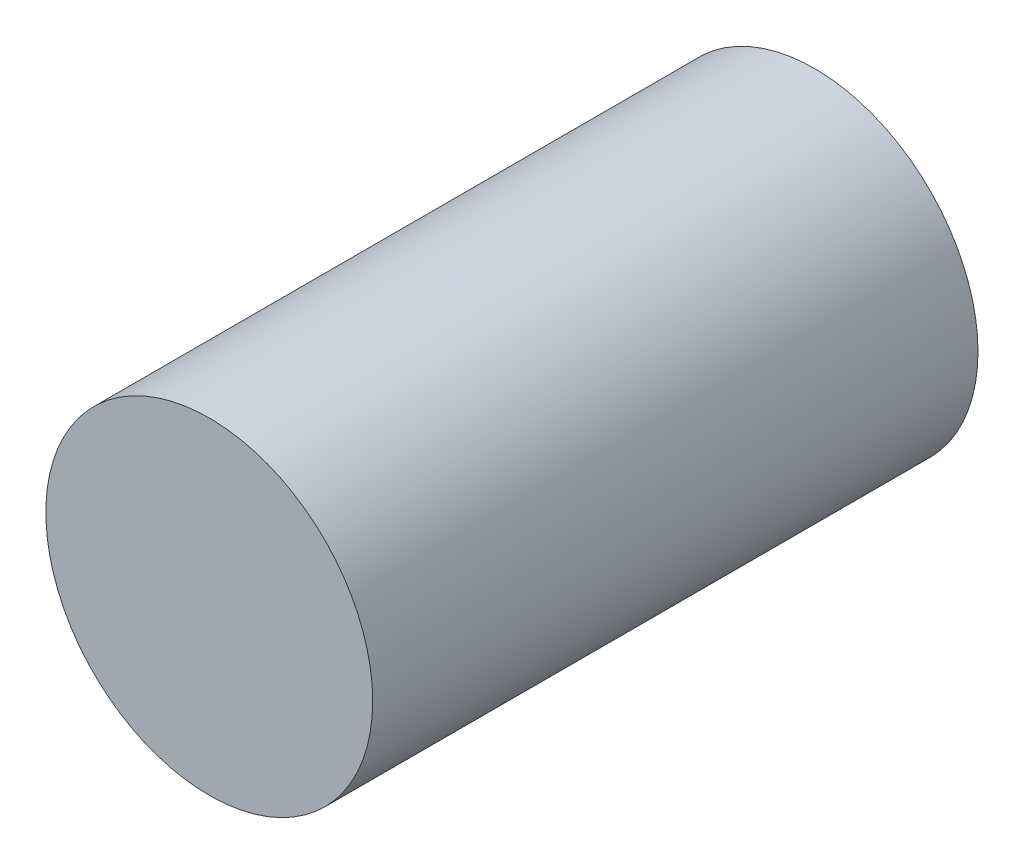
ISO-10303-21;
HEADER;
FILE_DESCRIPTION(('STEP AP214'),'2;1');
FILE_NAME('part.step','',(''),(''),'','','');
FILE_SCHEMA(('AUTOMOTIVE_DESIGN { 1 0 10303 214 1 1 1 1 }'));
ENDSEC;
DATA;
#1=APPLICATION_CONTEXT('core data for automotive mechanical design processes');
#2=APPLICATION_PROTOCOL_DEFINITION('international standard','automotive_design',2000,#1);
#3=PRODUCT_CONTEXT('',#1,'mechanical');
#4=PRODUCT('Part','Part','',(#3));
#5=PRODUCT_RELATED_PRODUCT_CATEGORY('part','',(#4));
#6=PRODUCT_DEFINITION_FORMATION('','',#4);
#7=PRODUCT_DEFINITION_CONTEXT('part definition',#1,'design');
#8=PRODUCT_DEFINITION('design','',#6,#7);
#9=PRODUCT_DEFINITION_SHAPE('','',#8);
#10=(LENGTH_UNIT() NAMED_UNIT(*) SI_UNIT(.MILLI.,.METRE.));
#11=(NAMED_UNIT(*) PLANE_ANGLE_UNIT() SI_UNIT($,.RADIAN.));
#12=(NAMED_UNIT(*) SI_UNIT($,.STERADIAN.) SOLID_ANGLE_UNIT());
#13=UNCERTAINTY_MEASURE_WITH_UNIT(LENGTH_MEASURE(1.E-05),#10,'distance_accuracy_value','');
#14=(GEOMETRIC_REPRESENTATION_CONTEXT(3) GLOBAL_UNCERTAINTY_ASSIGNED_CONTEXT((#13)) GLOBAL_UNIT_ASSIGNED_CONTEXT((#10,
#11,#12)) REPRESENTATION_CONTEXT('',''));
#15=CARTESIAN_POINT('',(0.,0.,0.));
#16=DIRECTION('',(0.,0.,1.));
#17=DIRECTION('',(1.,0.,0.));
#18=AXIS2_PLACEMENT_3D('',#15,#16,#17);
#19=CARTESIAN_POINT('',(1.3509,1.3509,5.0009));
#20=DIRECTION('',(0.,0.,1.));
#21=DIRECTION('',(1.,0.,0.));
#22=AXIS2_PLACEMENT_3D('',#19,#20,#21);
#23=PLANE('',#22);
#24=CARTESIAN_POINT('',(1.3509,1.3509,5.0009));
#25=DIRECTION('',(0.,0.,1.));
#26=DIRECTION('',(1.,0.,0.));
#27=AXIS2_PLACEMENT_3D('',#24,#25,#26);
#28=CIRCLE('',#27,1.35);
#29=CARTESIAN_POINT('',(2.7009,1.3509,5.0009));
#30=VERTEX_POINT('',#29);
#31=EDGE_CURVE('E16',#30,#30,#28,.F.);
#32=ORIENTED_EDGE('',*,*,#31,.F.);
#33=EDGE_LOOP('',(#32));
#34=FACE_BOUND('',#33,.T.);
#35=ADVANCED_FACE('F13',(#34),#23,.T.);
#36=CARTESIAN_POINT('',(1.3509,1.3509,0.0009000000000015));
#37=DIRECTION('',(0.,0.,1.));
#38=DIRECTION('',(1.,0.,0.));
#39=AXIS2_PLACEMENT_3D('',#36,#37,#38);
#40=PLANE('',#39);
#41=CARTESIAN_POINT('',(1.3509,1.3509,0.0009000000000015));
#42=DIRECTION('',(0.,0.,1.));
#43=DIRECTION('',(1.,0.,0.));
#44=AXIS2_PLACEMENT_3D('',#41,#42,#43);
#45=CIRCLE('',#44,1.35);
#46=CARTESIAN_POINT('',(2.7009,1.3509,0.0009000000000015));
#47=VERTEX_POINT('',#46);
#48=EDGE_CURVE('E8',#47,#47,#45,.T.);
#49=ORIENTED_EDGE('',*,*,#48,.F.);
#50=EDGE_LOOP('',(#49));
#51=FACE_BOUND('',#50,.T.);
#52=ADVANCED_FACE('F28',(#51),#40,.F.);
#53=CARTESIAN_POINT('',(1.3509,1.3509,0.0009000000000015));
#54=DIRECTION('',(0.,0.,1.));
#55=DIRECTION('',(1.,0.,0.));
#56=AXIS2_PLACEMENT_3D('',#53,#54,#55);
#57=CYLINDRICAL_SURFACE('',#56,1.35);
#58=ORIENTED_EDGE('',*,*,#48,.T.);
#59=EDGE_LOOP('',(#58));
#60=FACE_BOUND('',#59,.T.);
#61=ORIENTED_EDGE('',*,*,#31,.T.);
#62=EDGE_LOOP('',(#61));
#63=FACE_BOUND('',#62,.T.);
#64=ADVANCED_FACE('F25',(#60,#63),#57,.T.);
#65=CLOSED_SHELL('',(#35,#52,#64));
#66=MANIFOLD_SOLID_BREP('B1',#65);
#67=ADVANCED_BREP_SHAPE_REPRESENTATION('',(#18,#66),#14);
#68=SHAPE_DEFINITION_REPRESENTATION(#9,#67);
ENDSEC;
END-ISO-10303-21;
